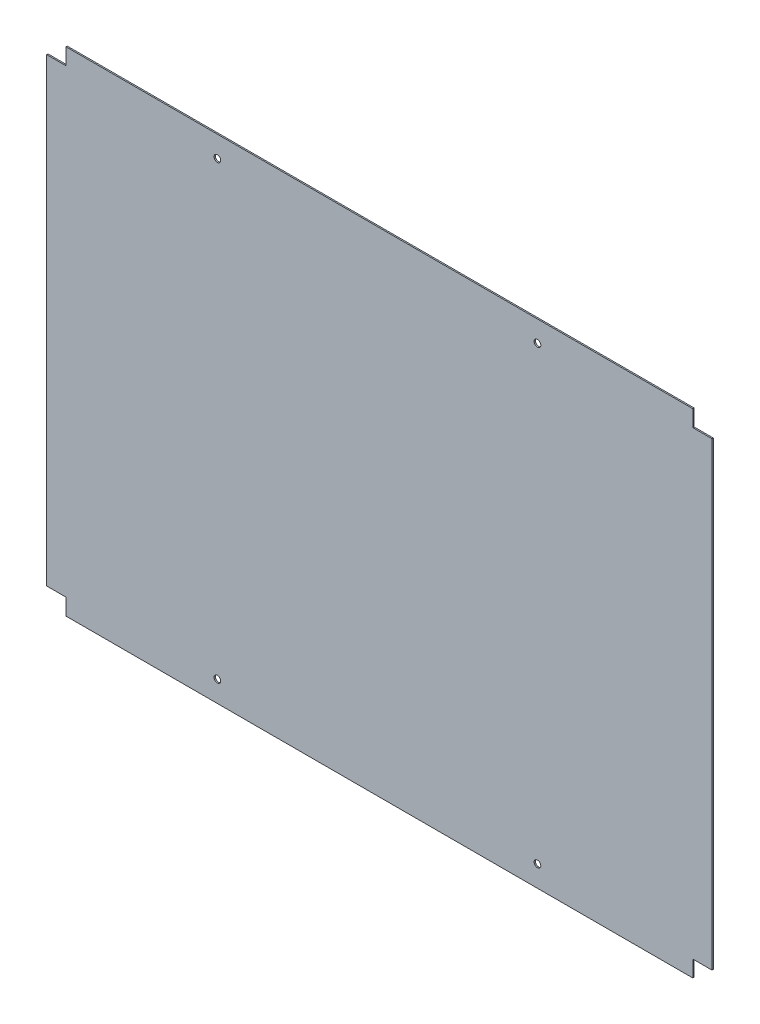
ISO-10303-21;
HEADER;
FILE_DESCRIPTION(('STEP AP214'),'2;1');
FILE_NAME('part.step','',(''),(''),'','','');
FILE_SCHEMA(('AUTOMOTIVE_DESIGN { 1 0 10303 214 1 1 1 1 }'));
ENDSEC;
DATA;
#1=APPLICATION_CONTEXT('core data for automotive mechanical design processes');
#2=APPLICATION_PROTOCOL_DEFINITION('international standard','automotive_design',2000,#1);
#3=PRODUCT_CONTEXT('',#1,'mechanical');
#4=PRODUCT('Part','Part','',(#3));
#5=PRODUCT_RELATED_PRODUCT_CATEGORY('part','',(#4));
#6=PRODUCT_DEFINITION_FORMATION('','',#4);
#7=PRODUCT_DEFINITION_CONTEXT('part definition',#1,'design');
#8=PRODUCT_DEFINITION('design','',#6,#7);
#9=PRODUCT_DEFINITION_SHAPE('','',#8);
#10=(LENGTH_UNIT() NAMED_UNIT(*) SI_UNIT(.MILLI.,.METRE.));
#11=(NAMED_UNIT(*) PLANE_ANGLE_UNIT() SI_UNIT($,.RADIAN.));
#12=(NAMED_UNIT(*) SI_UNIT($,.STERADIAN.) SOLID_ANGLE_UNIT());
#13=UNCERTAINTY_MEASURE_WITH_UNIT(LENGTH_MEASURE(1.E-05),#10,'distance_accuracy_value','');
#14=(GEOMETRIC_REPRESENTATION_CONTEXT(3) GLOBAL_UNCERTAINTY_ASSIGNED_CONTEXT((#13)) GLOBAL_UNIT_ASSIGNED_CONTEXT((#10,
#11,#12)) REPRESENTATION_CONTEXT('',''));
#15=CARTESIAN_POINT('',(0.,0.,0.));
#16=DIRECTION('',(0.,0.,1.));
#17=DIRECTION('',(1.,0.,0.));
#18=AXIS2_PLACEMENT_3D('',#15,#16,#17);
#19=CARTESIAN_POINT('',(0.,0.,-1.524));
#20=DIRECTION('',(0.,0.,-1.));
#21=DIRECTION('',(-1.,0.,0.));
#22=AXIS2_PLACEMENT_3D('',#19,#20,#21);
#23=PLANE('',#22);
#24=CARTESIAN_POINT('',(188.214,268.351,-1.524));
#25=DIRECTION('',(0.,0.,-1.));
#26=DIRECTION('',(-1.,0.,0.));
#27=AXIS2_PLACEMENT_3D('',#24,#25,#26);
#28=CIRCLE('',#27,3.9624);
#29=CARTESIAN_POINT('',(184.2516,268.351,-1.524));
#30=VERTEX_POINT('',#29);
#31=EDGE_CURVE('E380',#30,#30,#28,.T.);
#32=ORIENTED_EDGE('',*,*,#31,.F.);
#33=EDGE_LOOP('',(#32));
#34=FACE_BOUND('',#33,.T.);
#35=CARTESIAN_POINT('',(-192.786,-268.351,-1.524));
#36=DIRECTION('',(0.,0.,-1.));
#37=DIRECTION('',(-1.,0.,0.));
#38=AXIS2_PLACEMENT_3D('',#35,#36,#37);
#39=CIRCLE('',#38,3.9624);
#40=CARTESIAN_POINT('',(-196.7484,-268.351,-1.524));
#41=VERTEX_POINT('',#40);
#42=EDGE_CURVE('E376',#41,#41,#39,.T.);
#43=ORIENTED_EDGE('',*,*,#42,.F.);
#44=EDGE_LOOP('',(#43));
#45=FACE_BOUND('',#44,.T.);
#46=CARTESIAN_POINT('',(188.214,-268.351,-1.524));
#47=DIRECTION('',(0.,0.,-1.));
#48=DIRECTION('',(-1.,0.,0.));
#49=AXIS2_PLACEMENT_3D('',#46,#47,#48);
#50=CIRCLE('',#49,3.9624);
#51=CARTESIAN_POINT('',(184.2516,-268.351,-1.524));
#52=VERTEX_POINT('',#51);
#53=EDGE_CURVE('E372',#52,#52,#50,.T.);
#54=ORIENTED_EDGE('',*,*,#53,.F.);
#55=EDGE_LOOP('',(#54));
#56=FACE_BOUND('',#55,.T.);
#57=CARTESIAN_POINT('',(-192.786,268.351,-1.524));
#58=DIRECTION('',(0.,0.,-1.));
#59=DIRECTION('',(-1.,0.,0.));
#60=AXIS2_PLACEMENT_3D('',#57,#58,#59);
#61=CIRCLE('',#60,3.9624);
#62=CARTESIAN_POINT('',(-196.7484,268.351,-1.524));
#63=VERTEX_POINT('',#62);
#64=EDGE_CURVE('E368',#63,#63,#61,.T.);
#65=ORIENTED_EDGE('',*,*,#64,.F.);
#66=EDGE_LOOP('',(#65));
#67=FACE_BOUND('',#66,.T.);
#68=DIRECTION('',(-1.,0.,0.));
#69=VECTOR('',#68,1.);
#70=CARTESIAN_POINT('',(-379.476,-273.939,-1.524));
#71=LINE('',#70,#69);
#72=CARTESIAN_POINT('',(-373.2784,-273.939,-1.52399999999997));
#73=VERTEX_POINT('',#72);
#74=CARTESIAN_POINT('',(-395.972962531013,-273.939,-1.52399999999997));
#75=VERTEX_POINT('',#74);
#76=EDGE_CURVE('E483',#73,#75,#71,.T.);
#77=ORIENTED_EDGE('',*,*,#76,.T.);
#78=DIRECTION('',(0.,1.,0.));
#79=VECTOR('',#78,1.);
#80=CARTESIAN_POINT('',(-395.972962531013,0.,-1.52399999999991));
#81=LINE('',#80,#79);
#82=CARTESIAN_POINT('',(-395.972962531013,273.939,-1.52399999999986));
#83=VERTEX_POINT('',#82);
#84=EDGE_CURVE('E342',#75,#83,#81,.T.);
#85=ORIENTED_EDGE('',*,*,#84,.T.);
#86=DIRECTION('',(1.,0.,0.));
#87=VECTOR('',#86,1.);
#88=CARTESIAN_POINT('',(-379.476,273.939,-1.524));
#89=LINE('',#88,#87);
#90=CARTESIAN_POINT('',(-373.2784,273.939,-1.524));
#91=VERTEX_POINT('',#90);
#92=EDGE_CURVE('E499',#83,#91,#89,.T.);
#93=ORIENTED_EDGE('',*,*,#92,.T.);
#94=DIRECTION('',(0.,1.,0.));
#95=VECTOR('',#94,1.);
#96=CARTESIAN_POINT('',(-373.2784,273.7866,-1.52399999999997));
#97=LINE('',#96,#95);
#98=CARTESIAN_POINT('',(-373.2784,273.7866,-1.524));
#99=VERTEX_POINT('',#98);
#100=EDGE_CURVE('E453',#99,#91,#97,.T.);
#101=ORIENTED_EDGE('',*,*,#100,.F.);
#102=DIRECTION('',(-1.,0.,0.));
#103=VECTOR('',#102,1.);
#104=CARTESIAN_POINT('',(-373.126,273.7866,-1.52399999999997));
#105=LINE('',#104,#103);
#106=CARTESIAN_POINT('',(-373.126,273.7866,-1.524));
#107=VERTEX_POINT('',#106);
#108=EDGE_CURVE('E448',#107,#99,#105,.T.);
#109=ORIENTED_EDGE('',*,*,#108,.F.);
#110=DIRECTION('',(0.,-1.,0.));
#111=VECTOR('',#110,1.);
#112=CARTESIAN_POINT('',(-373.126,273.939,-1.52399999999997));
#113=LINE('',#112,#111);
#114=CARTESIAN_POINT('',(-373.126,293.483962531012,-1.52399999999991));
#115=VERTEX_POINT('',#114);
#116=EDGE_CURVE('E444',#115,#107,#113,.T.);
#117=ORIENTED_EDGE('',*,*,#116,.F.);
#118=DIRECTION('',(-1.,0.,0.));
#119=VECTOR('',#118,1.);
#120=CARTESIAN_POINT('',(0.,293.483962531012,-1.52399999999991));
#121=LINE('',#120,#119);
#122=CARTESIAN_POINT('',(373.126,293.483962531012,-1.52399999999991));
#123=VERTEX_POINT('',#122);
#124=EDGE_CURVE('E292',#115,#123,#121,.F.);
#125=ORIENTED_EDGE('',*,*,#124,.T.);
#126=DIRECTION('',(0.,1.,0.));
#127=VECTOR('',#126,1.);
#128=CARTESIAN_POINT('',(373.126,273.7866,-1.52399999999997));
#129=LINE('',#128,#127);
#130=CARTESIAN_POINT('',(373.126,273.7866,-1.524));
#131=VERTEX_POINT('',#130);
#132=EDGE_CURVE('E287',#131,#123,#129,.T.);
#133=ORIENTED_EDGE('',*,*,#132,.F.);
#134=DIRECTION('',(-1.,0.,0.));
#135=VECTOR('',#134,1.);
#136=CARTESIAN_POINT('',(373.2784,273.7866,-1.52399999999997));
#137=LINE('',#136,#135);
#138=CARTESIAN_POINT('',(373.2784,273.7866,-1.524));
#139=VERTEX_POINT('',#138);
#140=EDGE_CURVE('E436',#139,#131,#137,.T.);
#141=ORIENTED_EDGE('',*,*,#140,.F.);
#142=DIRECTION('',(0.,-1.,0.));
#143=VECTOR('',#142,1.);
#144=CARTESIAN_POINT('',(373.2784,276.987,-1.52399999999997));
#145=LINE('',#144,#143);
#146=CARTESIAN_POINT('',(373.2784,273.939,-1.52399999999997));
#147=VERTEX_POINT('',#146);
#148=EDGE_CURVE('E282',#147,#139,#145,.T.);
#149=ORIENTED_EDGE('',*,*,#148,.F.);
#150=DIRECTION('',(1.,0.,0.));
#151=VECTOR('',#150,1.);
#152=CARTESIAN_POINT('',(379.476,273.939,-1.524));
#153=LINE('',#152,#151);
#154=CARTESIAN_POINT('',(395.972962531012,273.939,-1.52399999999991));
#155=VERTEX_POINT('',#154);
#156=EDGE_CURVE('E478',#147,#155,#153,.T.);
#157=ORIENTED_EDGE('',*,*,#156,.T.);
#158=DIRECTION('',(0.,-1.,0.));
#159=VECTOR('',#158,1.);
#160=CARTESIAN_POINT('',(395.972962531012,0.,-1.52399999999991));
#161=LINE('',#160,#159);
#162=CARTESIAN_POINT('',(395.972962531012,-273.939,-1.52399999999991));
#163=VERTEX_POINT('',#162);
#164=EDGE_CURVE('E310',#155,#163,#161,.T.);
#165=ORIENTED_EDGE('',*,*,#164,.T.);
#166=DIRECTION('',(-1.,0.,0.));
#167=VECTOR('',#166,1.);
#168=CARTESIAN_POINT('',(379.476,-273.939,-1.524));
#169=LINE('',#168,#167);
#170=CARTESIAN_POINT('',(373.278399999999,-273.939,-1.524));
#171=VERTEX_POINT('',#170);
#172=EDGE_CURVE('E490',#163,#171,#169,.T.);
#173=ORIENTED_EDGE('',*,*,#172,.T.);
#174=DIRECTION('',(0.,-1.,0.));
#175=VECTOR('',#174,1.);
#176=CARTESIAN_POINT('',(373.278399999999,-273.7866,-1.52399999999997));
#177=LINE('',#176,#175);
#178=CARTESIAN_POINT('',(373.278399999999,-273.7866,-1.524));
#179=VERTEX_POINT('',#178);
#180=EDGE_CURVE('E404',#179,#171,#177,.T.);
#181=ORIENTED_EDGE('',*,*,#180,.F.);
#182=DIRECTION('',(1.,0.,0.));
#183=VECTOR('',#182,1.);
#184=CARTESIAN_POINT('',(373.125999999999,-273.7866,-1.52399999999997));
#185=LINE('',#184,#183);
#186=CARTESIAN_POINT('',(373.125999999999,-273.7866,-1.524));
#187=VERTEX_POINT('',#186);
#188=EDGE_CURVE('E399',#187,#179,#185,.T.);
#189=ORIENTED_EDGE('',*,*,#188,.F.);
#190=DIRECTION('',(0.,1.,0.));
#191=VECTOR('',#190,1.);
#192=CARTESIAN_POINT('',(373.125999999999,-273.939,-1.52399999999997));
#193=LINE('',#192,#191);
#194=CARTESIAN_POINT('',(373.126,-293.483962531012,-1.52399999999991));
#195=VERTEX_POINT('',#194);
#196=EDGE_CURVE('E395',#195,#187,#193,.T.);
#197=ORIENTED_EDGE('',*,*,#196,.F.);
#198=DIRECTION('',(-1.,0.,0.));
#199=VECTOR('',#198,1.);
#200=CARTESIAN_POINT('',(0.,-293.483962531012,-1.52399999999991));
#201=LINE('',#200,#199);
#202=CARTESIAN_POINT('',(-373.126,-293.483962531012,-1.52399999999991));
#203=VERTEX_POINT('',#202);
#204=EDGE_CURVE('E327',#195,#203,#201,.T.);
#205=ORIENTED_EDGE('',*,*,#204,.T.);
#206=DIRECTION('',(0.,-1.,0.));
#207=VECTOR('',#206,1.);
#208=CARTESIAN_POINT('',(-373.126,-273.7866,-1.52399999999997));
#209=LINE('',#208,#207);
#210=CARTESIAN_POINT('',(-373.126,-273.7866,-1.524));
#211=VERTEX_POINT('',#210);
#212=EDGE_CURVE('E154',#211,#203,#209,.T.);
#213=ORIENTED_EDGE('',*,*,#212,.F.);
#214=DIRECTION('',(1.,0.,0.));
#215=VECTOR('',#214,1.);
#216=CARTESIAN_POINT('',(-373.2784,-273.7866,-1.52399999999997));
#217=LINE('',#216,#215);
#218=CARTESIAN_POINT('',(-373.2784,-273.7866,-1.524));
#219=VERTEX_POINT('',#218);
#220=EDGE_CURVE('E149',#219,#211,#217,.T.);
#221=ORIENTED_EDGE('',*,*,#220,.F.);
#222=DIRECTION('',(0.,1.,0.));
#223=VECTOR('',#222,1.);
#224=CARTESIAN_POINT('',(-373.2784,-276.987,-1.52399999999997));
#225=LINE('',#224,#223);
#226=EDGE_CURVE('E385',#73,#219,#225,.T.);
#227=ORIENTED_EDGE('',*,*,#226,.F.);
#228=EDGE_LOOP('',(#77,#85,#93,#101,#109,#117,#125,#133,#141,#149,#157,#165,#173,#181,#189,#197,
#205,#213,#221,#227));
#229=FACE_BOUND('',#228,.T.);
#230=ADVANCED_FACE('F133',(#34,#45,#56,#67,#229),#23,.T.);
#231=CARTESIAN_POINT('',(0.,0.,0.));
#232=DIRECTION('',(0.,0.,-1.));
#233=DIRECTION('',(-1.,0.,0.));
#234=AXIS2_PLACEMENT_3D('',#231,#232,#233);
#235=PLANE('',#234);
#236=CARTESIAN_POINT('',(188.214,268.351,0.));
#237=DIRECTION('',(0.,0.,1.));
#238=DIRECTION('',(1.,0.,0.));
#239=AXIS2_PLACEMENT_3D('',#236,#237,#238);
#240=CIRCLE('',#239,3.9624);
#241=CARTESIAN_POINT('',(192.1764,268.351,0.));
#242=VERTEX_POINT('',#241);
#243=EDGE_CURVE('E357',#242,#242,#240,.T.);
#244=ORIENTED_EDGE('',*,*,#243,.F.);
#245=EDGE_LOOP('',(#244));
#246=FACE_BOUND('',#245,.T.);
#247=CARTESIAN_POINT('',(-192.786,-268.351,0.));
#248=DIRECTION('',(0.,0.,1.));
#249=DIRECTION('',(1.,0.,0.));
#250=AXIS2_PLACEMENT_3D('',#247,#248,#249);
#251=CIRCLE('',#250,3.9624);
#252=CARTESIAN_POINT('',(-188.8236,-268.351,0.));
#253=VERTEX_POINT('',#252);
#254=EDGE_CURVE('E356',#253,#253,#251,.T.);
#255=ORIENTED_EDGE('',*,*,#254,.F.);
#256=EDGE_LOOP('',(#255));
#257=FACE_BOUND('',#256,.T.);
#258=CARTESIAN_POINT('',(188.214,-268.351,0.));
#259=DIRECTION('',(0.,0.,1.));
#260=DIRECTION('',(1.,0.,0.));
#261=AXIS2_PLACEMENT_3D('',#258,#259,#260);
#262=CIRCLE('',#261,3.9624);
#263=CARTESIAN_POINT('',(192.1764,-268.351,0.));
#264=VERTEX_POINT('',#263);
#265=EDGE_CURVE('E341',#264,#264,#262,.T.);
#266=ORIENTED_EDGE('',*,*,#265,.F.);
#267=EDGE_LOOP('',(#266));
#268=FACE_BOUND('',#267,.T.);
#269=CARTESIAN_POINT('',(-192.786,268.351,0.));
#270=DIRECTION('',(0.,0.,1.));
#271=DIRECTION('',(1.,0.,0.));
#272=AXIS2_PLACEMENT_3D('',#269,#270,#271);
#273=CIRCLE('',#272,3.9624);
#274=CARTESIAN_POINT('',(-188.8236,268.351,0.));
#275=VERTEX_POINT('',#274);
#276=EDGE_CURVE('E361',#275,#275,#273,.T.);
#277=ORIENTED_EDGE('',*,*,#276,.F.);
#278=EDGE_LOOP('',(#277));
#279=FACE_BOUND('',#278,.T.);
#280=DIRECTION('',(1.,0.,0.));
#281=VECTOR('',#280,1.);
#282=CARTESIAN_POINT('',(-379.476,273.939,0.));
#283=LINE('',#282,#281);
#284=CARTESIAN_POINT('',(-395.972962531013,273.939,1.66533453693773E-13));
#285=VERTEX_POINT('',#284);
#286=CARTESIAN_POINT('',(-373.2784,273.939,0.));
#287=VERTEX_POINT('',#286);
#288=EDGE_CURVE('E482',#285,#287,#283,.T.);
#289=ORIENTED_EDGE('',*,*,#288,.F.);
#290=DIRECTION('',(0.,-1.,0.));
#291=VECTOR('',#290,1.);
#292=CARTESIAN_POINT('',(-395.972962531013,-273.939,1.11022302462516E-13));
#293=LINE('',#292,#291);
#294=CARTESIAN_POINT('',(-395.972962531013,-273.939,1.11022302462516E-13));
#295=VERTEX_POINT('',#294);
#296=EDGE_CURVE('E326',#295,#285,#293,.F.);
#297=ORIENTED_EDGE('',*,*,#296,.F.);
#298=DIRECTION('',(-1.,0.,0.));
#299=VECTOR('',#298,1.);
#300=CARTESIAN_POINT('',(-379.476,-273.939,0.));
#301=LINE('',#300,#299);
#302=CARTESIAN_POINT('',(-373.2784,-273.939,0.));
#303=VERTEX_POINT('',#302);
#304=EDGE_CURVE('E479',#303,#295,#301,.T.);
#305=ORIENTED_EDGE('',*,*,#304,.F.);
#306=DIRECTION('',(0.,-1.,0.));
#307=VECTOR('',#306,1.);
#308=CARTESIAN_POINT('',(-373.2784,0.,0.));
#309=LINE('',#308,#307);
#310=CARTESIAN_POINT('',(-373.2784,-273.7866,0.));
#311=VERTEX_POINT('',#310);
#312=EDGE_CURVE('E424',#311,#303,#309,.T.);
#313=ORIENTED_EDGE('',*,*,#312,.F.);
#314=DIRECTION('',(-1.,0.,0.));
#315=VECTOR('',#314,1.);
#316=CARTESIAN_POINT('',(0.,-273.7866,0.));
#317=LINE('',#316,#315);
#318=CARTESIAN_POINT('',(-373.126,-273.7866,0.));
#319=VERTEX_POINT('',#318);
#320=EDGE_CURVE('E13',#319,#311,#317,.T.);
#321=ORIENTED_EDGE('',*,*,#320,.F.);
#322=DIRECTION('',(0.,1.,0.));
#323=VECTOR('',#322,1.);
#324=CARTESIAN_POINT('',(-373.126,0.,0.));
#325=LINE('',#324,#323);
#326=CARTESIAN_POINT('',(-373.126,-293.483962531012,1.11022302462516E-13));
#327=VERTEX_POINT('',#326);
#328=EDGE_CURVE('E421',#327,#319,#325,.T.);
#329=ORIENTED_EDGE('',*,*,#328,.F.);
#330=DIRECTION('',(1.,0.,0.));
#331=VECTOR('',#330,1.);
#332=CARTESIAN_POINT('',(373.126,-293.483962531012,1.11022302462516E-13));
#333=LINE('',#332,#331);
#334=CARTESIAN_POINT('',(373.126,-293.483962531012,1.11022302462516E-13));
#335=VERTEX_POINT('',#334);
#336=EDGE_CURVE('E309',#335,#327,#333,.F.);
#337=ORIENTED_EDGE('',*,*,#336,.F.);
#338=DIRECTION('',(0.,-1.,0.));
#339=VECTOR('',#338,1.);
#340=CARTESIAN_POINT('',(373.125999999999,0.,0.));
#341=LINE('',#340,#339);
#342=CARTESIAN_POINT('',(373.125999999999,-273.7866,0.));
#343=VERTEX_POINT('',#342);
#344=EDGE_CURVE('E388',#343,#335,#341,.T.);
#345=ORIENTED_EDGE('',*,*,#344,.F.);
#346=DIRECTION('',(-1.,0.,0.));
#347=VECTOR('',#346,1.);
#348=CARTESIAN_POINT('',(0.,-273.7866,0.));
#349=LINE('',#348,#347);
#350=CARTESIAN_POINT('',(373.278399999999,-273.7866,0.));
#351=VERTEX_POINT('',#350);
#352=EDGE_CURVE('E142',#351,#343,#349,.T.);
#353=ORIENTED_EDGE('',*,*,#352,.F.);
#354=DIRECTION('',(0.,1.,0.));
#355=VECTOR('',#354,1.);
#356=CARTESIAN_POINT('',(373.278399999999,0.,0.));
#357=LINE('',#356,#355);
#358=CARTESIAN_POINT('',(373.278399999999,-273.939,0.));
#359=VERTEX_POINT('',#358);
#360=EDGE_CURVE('E428',#359,#351,#357,.T.);
#361=ORIENTED_EDGE('',*,*,#360,.F.);
#362=DIRECTION('',(-1.,0.,0.));
#363=VECTOR('',#362,1.);
#364=CARTESIAN_POINT('',(379.476,-273.939,0.));
#365=LINE('',#364,#363);
#366=CARTESIAN_POINT('',(395.972962531012,-273.939,1.11022302462516E-13));
#367=VERTEX_POINT('',#366);
#368=EDGE_CURVE('E486',#367,#359,#365,.T.);
#369=ORIENTED_EDGE('',*,*,#368,.F.);
#370=DIRECTION('',(0.,1.,0.));
#371=VECTOR('',#370,1.);
#372=CARTESIAN_POINT('',(395.972962531012,273.939,1.11022302462516E-13));
#373=LINE('',#372,#371);
#374=CARTESIAN_POINT('',(395.972962531012,273.939,1.11022302462516E-13));
#375=VERTEX_POINT('',#374);
#376=EDGE_CURVE('E318',#375,#367,#373,.F.);
#377=ORIENTED_EDGE('',*,*,#376,.F.);
#378=DIRECTION('',(1.,0.,0.));
#379=VECTOR('',#378,1.);
#380=CARTESIAN_POINT('',(379.476,273.939,0.));
#381=LINE('',#380,#379);
#382=CARTESIAN_POINT('',(373.2784,273.939,0.));
#383=VERTEX_POINT('',#382);
#384=EDGE_CURVE('E494',#383,#375,#381,.T.);
#385=ORIENTED_EDGE('',*,*,#384,.F.);
#386=DIRECTION('',(0.,1.,0.));
#387=VECTOR('',#386,1.);
#388=CARTESIAN_POINT('',(373.2784,0.,0.));
#389=LINE('',#388,#387);
#390=CARTESIAN_POINT('',(373.2784,273.7866,0.));
#391=VERTEX_POINT('',#390);
#392=EDGE_CURVE('E281',#391,#383,#389,.T.);
#393=ORIENTED_EDGE('',*,*,#392,.F.);
#394=DIRECTION('',(1.,0.,0.));
#395=VECTOR('',#394,1.);
#396=CARTESIAN_POINT('',(0.,273.7866,0.));
#397=LINE('',#396,#395);
#398=CARTESIAN_POINT('',(373.126,273.7866,0.));
#399=VERTEX_POINT('',#398);
#400=EDGE_CURVE('E276',#399,#391,#397,.T.);
#401=ORIENTED_EDGE('',*,*,#400,.F.);
#402=DIRECTION('',(0.,-1.,0.));
#403=VECTOR('',#402,1.);
#404=CARTESIAN_POINT('',(373.126,0.,0.));
#405=LINE('',#404,#403);
#406=CARTESIAN_POINT('',(373.126,293.483962531012,1.11022302462516E-13));
#407=VERTEX_POINT('',#406);
#408=EDGE_CURVE('E271',#407,#399,#405,.T.);
#409=ORIENTED_EDGE('',*,*,#408,.F.);
#410=DIRECTION('',(1.,0.,0.));
#411=VECTOR('',#410,1.);
#412=CARTESIAN_POINT('',(373.126,293.483962531012,1.11022302462516E-13));
#413=LINE('',#412,#411);
#414=CARTESIAN_POINT('',(-373.126,293.483962531012,1.11022302462516E-13));
#415=VERTEX_POINT('',#414);
#416=EDGE_CURVE('E274',#415,#407,#413,.T.);
#417=ORIENTED_EDGE('',*,*,#416,.F.);
#418=DIRECTION('',(0.,1.,0.));
#419=VECTOR('',#418,1.);
#420=CARTESIAN_POINT('',(-373.126,0.,0.));
#421=LINE('',#420,#419);
#422=CARTESIAN_POINT('',(-373.126,273.7866,0.));
#423=VERTEX_POINT('',#422);
#424=EDGE_CURVE('E475',#423,#415,#421,.T.);
#425=ORIENTED_EDGE('',*,*,#424,.F.);
#426=DIRECTION('',(1.,0.,0.));
#427=VECTOR('',#426,1.);
#428=CARTESIAN_POINT('',(0.,273.7866,0.));
#429=LINE('',#428,#427);
#430=CARTESIAN_POINT('',(-373.2784,273.7866,0.));
#431=VERTEX_POINT('',#430);
#432=EDGE_CURVE('E512',#431,#423,#429,.T.);
#433=ORIENTED_EDGE('',*,*,#432,.F.);
#434=DIRECTION('',(0.,-1.,0.));
#435=VECTOR('',#434,1.);
#436=CARTESIAN_POINT('',(-373.2784,0.,0.));
#437=LINE('',#436,#435);
#438=EDGE_CURVE('E471',#287,#431,#437,.T.);
#439=ORIENTED_EDGE('',*,*,#438,.F.);
#440=EDGE_LOOP('',(#289,#297,#305,#313,#321,#329,#337,#345,#353,#361,#369,#377,#385,#393,#401,
#409,#417,#425,#433,#439));
#441=FACE_BOUND('',#440,.T.);
#442=ADVANCED_FACE('F135',(#246,#257,#268,#279,#441),#235,.F.);
#443=CARTESIAN_POINT('',(-379.476,-273.939,-1.524));
#444=DIRECTION('',(0.,1.,0.));
#445=DIRECTION('',(0.,0.,1.));
#446=AXIS2_PLACEMENT_3D('',#443,#444,#445);
#447=PLANE('',#446);
#448=ORIENTED_EDGE('',*,*,#304,.T.);
#449=DIRECTION('',(0.,0.,-1.));
#450=VECTOR('',#449,1.);
#451=CARTESIAN_POINT('',(-395.972962531013,-273.939,0.));
#452=LINE('',#451,#450);
#453=EDGE_CURVE('E337',#295,#75,#452,.T.);
#454=ORIENTED_EDGE('',*,*,#453,.T.);
#455=ORIENTED_EDGE('',*,*,#76,.F.);
#456=DIRECTION('',(0.,0.,-1.));
#457=VECTOR('',#456,1.);
#458=CARTESIAN_POINT('',(-373.2784,-273.939,-1.524));
#459=LINE('',#458,#457);
#460=EDGE_CURVE('E518',#303,#73,#459,.T.);
#461=ORIENTED_EDGE('',*,*,#460,.F.);
#462=EDGE_LOOP('',(#448,#454,#455,#461));
#463=FACE_BOUND('',#462,.T.);
#464=ADVANCED_FACE('F579',(#463),#447,.F.);
#465=CARTESIAN_POINT('',(-379.476,273.939,-1.524));
#466=DIRECTION('',(0.,-1.,0.));
#467=DIRECTION('',(0.,0.,-1.));
#468=AXIS2_PLACEMENT_3D('',#465,#466,#467);
#469=PLANE('',#468);
#470=ORIENTED_EDGE('',*,*,#92,.F.);
#471=DIRECTION('',(0.,0.,-1.));
#472=VECTOR('',#471,1.);
#473=CARTESIAN_POINT('',(-395.972962531013,273.939,1.11022302462516E-13));
#474=LINE('',#473,#472);
#475=EDGE_CURVE('E346',#285,#83,#474,.T.);
#476=ORIENTED_EDGE('',*,*,#475,.F.);
#477=ORIENTED_EDGE('',*,*,#288,.T.);
#478=DIRECTION('',(0.,0.,1.));
#479=VECTOR('',#478,1.);
#480=CARTESIAN_POINT('',(-373.2784,273.939,-1.524));
#481=LINE('',#480,#479);
#482=EDGE_CURVE('E508',#91,#287,#481,.T.);
#483=ORIENTED_EDGE('',*,*,#482,.F.);
#484=EDGE_LOOP('',(#470,#476,#477,#483));
#485=FACE_BOUND('',#484,.T.);
#486=ADVANCED_FACE('F573',(#485),#469,.F.);
#487=CARTESIAN_POINT('',(-373.2784,-273.7866,-1.52399999999997));
#488=DIRECTION('',(0.,-1.,0.));
#489=DIRECTION('',(0.,0.,-1.));
#490=AXIS2_PLACEMENT_3D('',#487,#488,#489);
#491=PLANE('',#490);
#492=DIRECTION('',(0.,0.,1.));
#493=VECTOR('',#492,1.);
#494=CARTESIAN_POINT('',(-373.126,-273.7866,-1.52399999999997));
#495=LINE('',#494,#493);
#496=EDGE_CURVE('E394',#211,#319,#495,.T.);
#497=ORIENTED_EDGE('',*,*,#496,.T.);
#498=ORIENTED_EDGE('',*,*,#320,.T.);
#499=DIRECTION('',(0.,0.,1.));
#500=VECTOR('',#499,1.);
#501=CARTESIAN_POINT('',(-373.2784,-273.7866,-1.52399999999997));
#502=LINE('',#501,#500);
#503=EDGE_CURVE('E391',#219,#311,#502,.T.);
#504=ORIENTED_EDGE('',*,*,#503,.F.);
#505=ORIENTED_EDGE('',*,*,#220,.T.);
#506=EDGE_LOOP('',(#497,#498,#504,#505));
#507=FACE_BOUND('',#506,.T.);
#508=ADVANCED_FACE('F584',(#507),#491,.T.);
#509=CARTESIAN_POINT('',(373.125999999999,-273.7866,-1.52399999999997));
#510=DIRECTION('',(0.,-1.,0.));
#511=DIRECTION('',(0.,0.,-1.));
#512=AXIS2_PLACEMENT_3D('',#509,#510,#511);
#513=PLANE('',#512);
#514=DIRECTION('',(0.,0.,1.));
#515=VECTOR('',#514,1.);
#516=CARTESIAN_POINT('',(373.278399999999,-273.7866,-1.52399999999997));
#517=LINE('',#516,#515);
#518=EDGE_CURVE('E384',#179,#351,#517,.T.);
#519=ORIENTED_EDGE('',*,*,#518,.T.);
#520=ORIENTED_EDGE('',*,*,#352,.T.);
#521=DIRECTION('',(0.,0.,1.));
#522=VECTOR('',#521,1.);
#523=CARTESIAN_POINT('',(373.125999999999,-273.7866,-1.52399999999997));
#524=LINE('',#523,#522);
#525=EDGE_CURVE('E403',#187,#343,#524,.T.);
#526=ORIENTED_EDGE('',*,*,#525,.F.);
#527=ORIENTED_EDGE('',*,*,#188,.T.);
#528=EDGE_LOOP('',(#519,#520,#526,#527));
#529=FACE_BOUND('',#528,.T.);
#530=ADVANCED_FACE('F530',(#529),#513,.T.);
#531=CARTESIAN_POINT('',(373.278399999999,-273.7866,-1.52399999999997));
#532=DIRECTION('',(-1.,0.,0.));
#533=DIRECTION('',(0.,0.,1.));
#534=AXIS2_PLACEMENT_3D('',#531,#532,#533);
#535=PLANE('',#534);
#536=DIRECTION('',(0.,0.,1.));
#537=VECTOR('',#536,1.);
#538=CARTESIAN_POINT('',(373.278399999999,-273.939,-1.524));
#539=LINE('',#538,#537);
#540=EDGE_CURVE('E522',#171,#359,#539,.T.);
#541=ORIENTED_EDGE('',*,*,#540,.T.);
#542=ORIENTED_EDGE('',*,*,#360,.T.);
#543=ORIENTED_EDGE('',*,*,#518,.F.);
#544=ORIENTED_EDGE('',*,*,#180,.T.);
#545=EDGE_LOOP('',(#541,#542,#543,#544));
#546=FACE_BOUND('',#545,.T.);
#547=ADVANCED_FACE('F537',(#546),#535,.T.);
#548=CARTESIAN_POINT('',(-373.2784,-276.987,-1.52399999999997));
#549=DIRECTION('',(1.,0.,0.));
#550=DIRECTION('',(0.,0.,-1.));
#551=AXIS2_PLACEMENT_3D('',#548,#549,#550);
#552=PLANE('',#551);
#553=ORIENTED_EDGE('',*,*,#503,.T.);
#554=ORIENTED_EDGE('',*,*,#312,.T.);
#555=ORIENTED_EDGE('',*,*,#460,.T.);
#556=ORIENTED_EDGE('',*,*,#226,.T.);
#557=EDGE_LOOP('',(#553,#554,#555,#556));
#558=FACE_BOUND('',#557,.T.);
#559=ADVANCED_FACE('F581',(#558),#552,.T.);
#560=CARTESIAN_POINT('',(-373.126,-273.7866,-1.52399999999997));
#561=DIRECTION('',(-1.,0.,0.));
#562=DIRECTION('',(0.,0.,1.));
#563=AXIS2_PLACEMENT_3D('',#560,#561,#562);
#564=PLANE('',#563);
#565=ORIENTED_EDGE('',*,*,#212,.T.);
#566=DIRECTION('',(0.,0.,-1.));
#567=VECTOR('',#566,1.);
#568=CARTESIAN_POINT('',(-373.126,-293.483962531012,1.11022302462516E-13));
#569=LINE('',#568,#567);
#570=EDGE_CURVE('E330',#327,#203,#569,.T.);
#571=ORIENTED_EDGE('',*,*,#570,.F.);
#572=ORIENTED_EDGE('',*,*,#328,.T.);
#573=ORIENTED_EDGE('',*,*,#496,.F.);
#574=EDGE_LOOP('',(#565,#571,#572,#573));
#575=FACE_BOUND('',#574,.T.);
#576=ADVANCED_FACE('F588',(#575),#564,.T.);
#577=CARTESIAN_POINT('',(373.125999999999,-273.939,-1.52399999999997));
#578=DIRECTION('',(1.,0.,0.));
#579=DIRECTION('',(0.,0.,-1.));
#580=AXIS2_PLACEMENT_3D('',#577,#578,#579);
#581=PLANE('',#580);
#582=ORIENTED_EDGE('',*,*,#525,.T.);
#583=ORIENTED_EDGE('',*,*,#344,.T.);
#584=DIRECTION('',(0.,0.,-1.));
#585=VECTOR('',#584,1.);
#586=CARTESIAN_POINT('',(373.126,-293.483962531012,1.11022302462516E-13));
#587=LINE('',#586,#585);
#588=EDGE_CURVE('E322',#335,#195,#587,.T.);
#589=ORIENTED_EDGE('',*,*,#588,.T.);
#590=ORIENTED_EDGE('',*,*,#196,.T.);
#591=EDGE_LOOP('',(#582,#583,#589,#590));
#592=FACE_BOUND('',#591,.T.);
#593=ADVANCED_FACE('F533',(#592),#581,.T.);
#594=CARTESIAN_POINT('',(379.476,-273.939,-1.524));
#595=DIRECTION('',(0.,1.,0.));
#596=DIRECTION('',(0.,0.,1.));
#597=AXIS2_PLACEMENT_3D('',#594,#595,#596);
#598=PLANE('',#597);
#599=ORIENTED_EDGE('',*,*,#540,.F.);
#600=ORIENTED_EDGE('',*,*,#172,.F.);
#601=DIRECTION('',(0.,0.,-1.));
#602=VECTOR('',#601,1.);
#603=CARTESIAN_POINT('',(395.972962531012,-273.939,1.11022302462516E-13));
#604=LINE('',#603,#602);
#605=EDGE_CURVE('E314',#367,#163,#604,.T.);
#606=ORIENTED_EDGE('',*,*,#605,.F.);
#607=ORIENTED_EDGE('',*,*,#368,.T.);
#608=EDGE_LOOP('',(#599,#600,#606,#607));
#609=FACE_BOUND('',#608,.T.);
#610=ADVANCED_FACE('F541',(#609),#598,.F.);
#611=CARTESIAN_POINT('',(379.476,273.939,-1.524));
#612=DIRECTION('',(0.,-1.,0.));
#613=DIRECTION('',(0.,0.,-1.));
#614=AXIS2_PLACEMENT_3D('',#611,#612,#613);
#615=PLANE('',#614);
#616=ORIENTED_EDGE('',*,*,#384,.T.);
#617=DIRECTION('',(0.,0.,-1.));
#618=VECTOR('',#617,1.);
#619=CARTESIAN_POINT('',(395.972962531012,273.939,1.11022302462516E-13));
#620=LINE('',#619,#618);
#621=EDGE_CURVE('E305',#375,#155,#620,.T.);
#622=ORIENTED_EDGE('',*,*,#621,.T.);
#623=ORIENTED_EDGE('',*,*,#156,.F.);
#624=DIRECTION('',(0.,0.,-1.));
#625=VECTOR('',#624,1.);
#626=CARTESIAN_POINT('',(373.2784,273.939,-1.524));
#627=LINE('',#626,#625);
#628=EDGE_CURVE('E502',#383,#147,#627,.T.);
#629=ORIENTED_EDGE('',*,*,#628,.F.);
#630=EDGE_LOOP('',(#616,#622,#623,#629));
#631=FACE_BOUND('',#630,.T.);
#632=ADVANCED_FACE('F611',(#631),#615,.F.);
#633=CARTESIAN_POINT('',(373.2784,273.7866,-1.52399999999997));
#634=DIRECTION('',(0.,1.,0.));
#635=DIRECTION('',(0.,0.,1.));
#636=AXIS2_PLACEMENT_3D('',#633,#634,#635);
#637=PLANE('',#636);
#638=DIRECTION('',(0.,0.,1.));
#639=VECTOR('',#638,1.);
#640=CARTESIAN_POINT('',(373.126,273.7866,-1.52399999999997));
#641=LINE('',#640,#639);
#642=EDGE_CURVE('E443',#131,#399,#641,.T.);
#643=ORIENTED_EDGE('',*,*,#642,.T.);
#644=ORIENTED_EDGE('',*,*,#400,.T.);
#645=DIRECTION('',(0.,0.,1.));
#646=VECTOR('',#645,1.);
#647=CARTESIAN_POINT('',(373.2784,273.7866,-1.52399999999997));
#648=LINE('',#647,#646);
#649=EDGE_CURVE('E440',#139,#391,#648,.T.);
#650=ORIENTED_EDGE('',*,*,#649,.F.);
#651=ORIENTED_EDGE('',*,*,#140,.T.);
#652=EDGE_LOOP('',(#643,#644,#650,#651));
#653=FACE_BOUND('',#652,.T.);
#654=ADVANCED_FACE('F553',(#653),#637,.T.);
#655=CARTESIAN_POINT('',(-373.126,273.7866,-1.52399999999997));
#656=DIRECTION('',(0.,1.,0.));
#657=DIRECTION('',(0.,0.,1.));
#658=AXIS2_PLACEMENT_3D('',#655,#656,#657);
#659=PLANE('',#658);
#660=DIRECTION('',(0.,0.,1.));
#661=VECTOR('',#660,1.);
#662=CARTESIAN_POINT('',(-373.2784,273.7866,-1.52399999999997));
#663=LINE('',#662,#661);
#664=EDGE_CURVE('E432',#99,#431,#663,.T.);
#665=ORIENTED_EDGE('',*,*,#664,.T.);
#666=ORIENTED_EDGE('',*,*,#432,.T.);
#667=DIRECTION('',(0.,0.,1.));
#668=VECTOR('',#667,1.);
#669=CARTESIAN_POINT('',(-373.126,273.7866,-1.52399999999997));
#670=LINE('',#669,#668);
#671=EDGE_CURVE('E452',#107,#423,#670,.T.);
#672=ORIENTED_EDGE('',*,*,#671,.F.);
#673=ORIENTED_EDGE('',*,*,#108,.T.);
#674=EDGE_LOOP('',(#665,#666,#672,#673));
#675=FACE_BOUND('',#674,.T.);
#676=ADVANCED_FACE('F564',(#675),#659,.T.);
#677=CARTESIAN_POINT('',(-373.126,273.939,-1.52399999999997));
#678=DIRECTION('',(-1.,0.,0.));
#679=DIRECTION('',(0.,0.,1.));
#680=AXIS2_PLACEMENT_3D('',#677,#678,#679);
#681=PLANE('',#680);
#682=ORIENTED_EDGE('',*,*,#671,.T.);
#683=ORIENTED_EDGE('',*,*,#424,.T.);
#684=DIRECTION('',(0.,0.,-1.));
#685=VECTOR('',#684,1.);
#686=CARTESIAN_POINT('',(-373.126,293.483962531012,1.11022302462516E-13));
#687=LINE('',#686,#685);
#688=EDGE_CURVE('E297',#415,#115,#687,.T.);
#689=ORIENTED_EDGE('',*,*,#688,.T.);
#690=ORIENTED_EDGE('',*,*,#116,.T.);
#691=EDGE_LOOP('',(#682,#683,#689,#690));
#692=FACE_BOUND('',#691,.T.);
#693=ADVANCED_FACE('F560',(#692),#681,.T.);
#694=CARTESIAN_POINT('',(-373.2784,273.7866,-1.52399999999997));
#695=DIRECTION('',(1.,0.,0.));
#696=DIRECTION('',(0.,0.,-1.));
#697=AXIS2_PLACEMENT_3D('',#694,#695,#696);
#698=PLANE('',#697);
#699=ORIENTED_EDGE('',*,*,#482,.T.);
#700=ORIENTED_EDGE('',*,*,#438,.T.);
#701=ORIENTED_EDGE('',*,*,#664,.F.);
#702=ORIENTED_EDGE('',*,*,#100,.T.);
#703=EDGE_LOOP('',(#699,#700,#701,#702));
#704=FACE_BOUND('',#703,.T.);
#705=ADVANCED_FACE('F567',(#704),#698,.T.);
#706=CARTESIAN_POINT('',(373.2784,276.987,-1.52399999999997));
#707=DIRECTION('',(-1.,0.,0.));
#708=DIRECTION('',(0.,0.,1.));
#709=AXIS2_PLACEMENT_3D('',#706,#707,#708);
#710=PLANE('',#709);
#711=ORIENTED_EDGE('',*,*,#649,.T.);
#712=ORIENTED_EDGE('',*,*,#392,.T.);
#713=ORIENTED_EDGE('',*,*,#628,.T.);
#714=ORIENTED_EDGE('',*,*,#148,.T.);
#715=EDGE_LOOP('',(#711,#712,#713,#714));
#716=FACE_BOUND('',#715,.T.);
#717=ADVANCED_FACE('F549',(#716),#710,.T.);
#718=CARTESIAN_POINT('',(373.126,273.7866,-1.52399999999997));
#719=DIRECTION('',(1.,0.,0.));
#720=DIRECTION('',(0.,0.,-1.));
#721=AXIS2_PLACEMENT_3D('',#718,#719,#720);
#722=PLANE('',#721);
#723=ORIENTED_EDGE('',*,*,#132,.T.);
#724=DIRECTION('',(0.,0.,-1.));
#725=VECTOR('',#724,1.);
#726=CARTESIAN_POINT('',(373.126,293.483962531012,1.11022302462516E-13));
#727=LINE('',#726,#725);
#728=EDGE_CURVE('E285',#407,#123,#727,.T.);
#729=ORIENTED_EDGE('',*,*,#728,.F.);
#730=ORIENTED_EDGE('',*,*,#408,.T.);
#731=ORIENTED_EDGE('',*,*,#642,.F.);
#732=EDGE_LOOP('',(#723,#729,#730,#731));
#733=FACE_BOUND('',#732,.T.);
#734=ADVANCED_FACE('F286',(#733),#722,.T.);
#735=CARTESIAN_POINT('',(-192.786,268.351,-19.05));
#736=DIRECTION('',(0.,0.,1.));
#737=DIRECTION('',(1.,0.,0.));
#738=AXIS2_PLACEMENT_3D('',#735,#736,#737);
#739=CYLINDRICAL_SURFACE('',#738,3.9624);
#740=ORIENTED_EDGE('',*,*,#64,.T.);
#741=EDGE_LOOP('',(#740));
#742=FACE_BOUND('',#741,.T.);
#743=ORIENTED_EDGE('',*,*,#276,.T.);
#744=EDGE_LOOP('',(#743));
#745=FACE_BOUND('',#744,.T.);
#746=ADVANCED_FACE('F624',(#742,#745),#739,.F.);
#747=CARTESIAN_POINT('',(188.214,-268.351,-19.05));
#748=DIRECTION('',(0.,0.,1.));
#749=DIRECTION('',(1.,0.,0.));
#750=AXIS2_PLACEMENT_3D('',#747,#748,#749);
#751=CYLINDRICAL_SURFACE('',#750,3.9624);
#752=ORIENTED_EDGE('',*,*,#53,.T.);
#753=EDGE_LOOP('',(#752));
#754=FACE_BOUND('',#753,.T.);
#755=ORIENTED_EDGE('',*,*,#265,.T.);
#756=EDGE_LOOP('',(#755));
#757=FACE_BOUND('',#756,.T.);
#758=ADVANCED_FACE('F645',(#754,#757),#751,.F.);
#759=CARTESIAN_POINT('',(-192.786,-268.351,-19.05));
#760=DIRECTION('',(0.,0.,1.));
#761=DIRECTION('',(1.,0.,0.));
#762=AXIS2_PLACEMENT_3D('',#759,#760,#761);
#763=CYLINDRICAL_SURFACE('',#762,3.9624);
#764=ORIENTED_EDGE('',*,*,#42,.T.);
#765=EDGE_LOOP('',(#764));
#766=FACE_BOUND('',#765,.T.);
#767=ORIENTED_EDGE('',*,*,#254,.T.);
#768=EDGE_LOOP('',(#767));
#769=FACE_BOUND('',#768,.T.);
#770=ADVANCED_FACE('F647',(#766,#769),#763,.F.);
#771=CARTESIAN_POINT('',(188.214,268.351,-19.05));
#772=DIRECTION('',(0.,0.,1.));
#773=DIRECTION('',(1.,0.,0.));
#774=AXIS2_PLACEMENT_3D('',#771,#772,#773);
#775=CYLINDRICAL_SURFACE('',#774,3.9624);
#776=ORIENTED_EDGE('',*,*,#31,.T.);
#777=EDGE_LOOP('',(#776));
#778=FACE_BOUND('',#777,.T.);
#779=ORIENTED_EDGE('',*,*,#243,.T.);
#780=EDGE_LOOP('',(#779));
#781=FACE_BOUND('',#780,.T.);
#782=ADVANCED_FACE('F598',(#778,#781),#775,.F.);
#783=CARTESIAN_POINT('',(-395.972962531013,-273.939,0.));
#784=DIRECTION('',(-1.,0.,0.));
#785=DIRECTION('',(0.,0.,1.));
#786=AXIS2_PLACEMENT_3D('',#783,#784,#785);
#787=PLANE('',#786);
#788=ORIENTED_EDGE('',*,*,#84,.F.);
#789=ORIENTED_EDGE('',*,*,#453,.F.);
#790=ORIENTED_EDGE('',*,*,#296,.T.);
#791=ORIENTED_EDGE('',*,*,#475,.T.);
#792=EDGE_LOOP('',(#788,#789,#790,#791));
#793=FACE_BOUND('',#792,.T.);
#794=ADVANCED_FACE('F577',(#793),#787,.T.);
#795=CARTESIAN_POINT('',(373.126,-293.483962531012,1.11022302462516E-13));
#796=DIRECTION('',(0.,-1.,0.));
#797=DIRECTION('',(0.,0.,-1.));
#798=AXIS2_PLACEMENT_3D('',#795,#796,#797);
#799=PLANE('',#798);
#800=ORIENTED_EDGE('',*,*,#204,.F.);
#801=ORIENTED_EDGE('',*,*,#588,.F.);
#802=ORIENTED_EDGE('',*,*,#336,.T.);
#803=ORIENTED_EDGE('',*,*,#570,.T.);
#804=EDGE_LOOP('',(#800,#801,#802,#803));
#805=FACE_BOUND('',#804,.T.);
#806=ADVANCED_FACE('F590',(#805),#799,.T.);
#807=CARTESIAN_POINT('',(395.972962531012,273.939,1.11022302462516E-13));
#808=DIRECTION('',(1.,0.,0.));
#809=DIRECTION('',(0.,0.,-1.));
#810=AXIS2_PLACEMENT_3D('',#807,#808,#809);
#811=PLANE('',#810);
#812=ORIENTED_EDGE('',*,*,#164,.F.);
#813=ORIENTED_EDGE('',*,*,#621,.F.);
#814=ORIENTED_EDGE('',*,*,#376,.T.);
#815=ORIENTED_EDGE('',*,*,#605,.T.);
#816=EDGE_LOOP('',(#812,#813,#814,#815));
#817=FACE_BOUND('',#816,.T.);
#818=ADVANCED_FACE('F545',(#817),#811,.T.);
#819=CARTESIAN_POINT('',(373.126,293.483962531012,1.11022302462516E-13));
#820=DIRECTION('',(0.,1.,0.));
#821=DIRECTION('',(0.,0.,1.));
#822=AXIS2_PLACEMENT_3D('',#819,#820,#821);
#823=PLANE('',#822);
#824=ORIENTED_EDGE('',*,*,#124,.F.);
#825=ORIENTED_EDGE('',*,*,#688,.F.);
#826=ORIENTED_EDGE('',*,*,#416,.T.);
#827=ORIENTED_EDGE('',*,*,#728,.T.);
#828=EDGE_LOOP('',(#824,#825,#826,#827));
#829=FACE_BOUND('',#828,.T.);
#830=ADVANCED_FACE('F295',(#829),#823,.T.);
#831=CLOSED_SHELL('',(#230,#442,#464,#486,#508,#530,#547,#559,#576,#593,#610,#632,#654,#676,
#693,#705,#717,#734,#746,#758,#770,#782,#794,#806,#818,#830));
#832=MANIFOLD_SOLID_BREP('B2',#831);
#833=ADVANCED_BREP_SHAPE_REPRESENTATION('',(#18,#832),#14);
#834=SHAPE_DEFINITION_REPRESENTATION(#9,#833);
ENDSEC;
END-ISO-10303-21;
